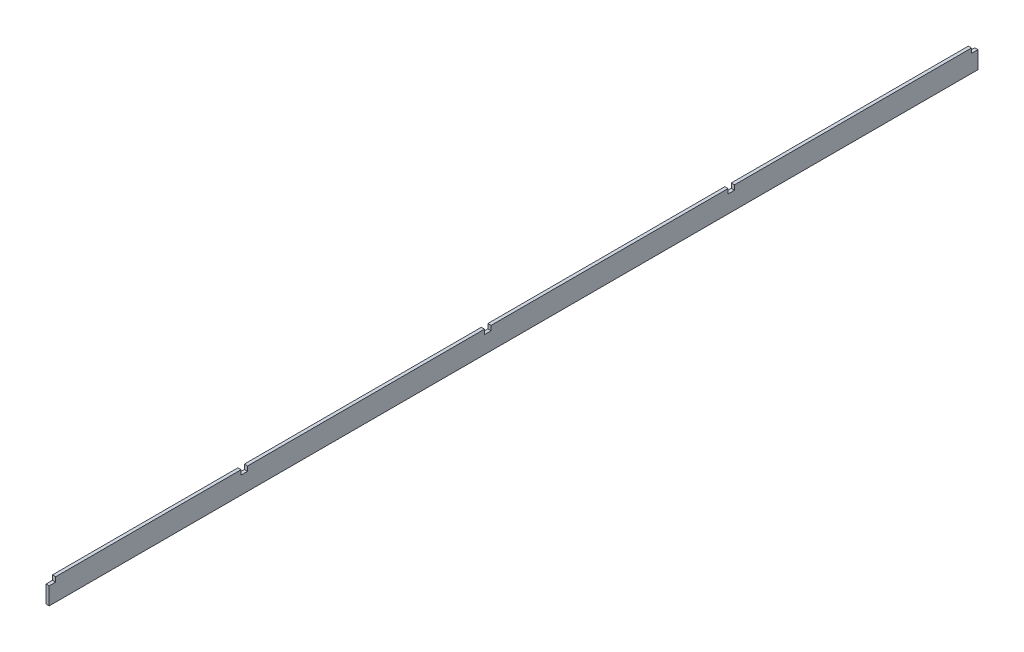
ISO-10303-21;
HEADER;
FILE_DESCRIPTION(('STEP AP214'),'2;1');
FILE_NAME('part.step','',(''),(''),'','','');
FILE_SCHEMA(('AUTOMOTIVE_DESIGN { 1 0 10303 214 1 1 1 1 }'));
ENDSEC;
DATA;
#1=APPLICATION_CONTEXT('core data for automotive mechanical design processes');
#2=APPLICATION_PROTOCOL_DEFINITION('international standard','automotive_design',2000,#1);
#3=PRODUCT_CONTEXT('',#1,'mechanical');
#4=PRODUCT('Part','Part','',(#3));
#5=PRODUCT_RELATED_PRODUCT_CATEGORY('part','',(#4));
#6=PRODUCT_DEFINITION_FORMATION('','',#4);
#7=PRODUCT_DEFINITION_CONTEXT('part definition',#1,'design');
#8=PRODUCT_DEFINITION('design','',#6,#7);
#9=PRODUCT_DEFINITION_SHAPE('','',#8);
#10=(LENGTH_UNIT() NAMED_UNIT(*) SI_UNIT(.MILLI.,.METRE.));
#11=(NAMED_UNIT(*) PLANE_ANGLE_UNIT() SI_UNIT($,.RADIAN.));
#12=(NAMED_UNIT(*) SI_UNIT($,.STERADIAN.) SOLID_ANGLE_UNIT());
#13=UNCERTAINTY_MEASURE_WITH_UNIT(LENGTH_MEASURE(1.E-05),#10,'distance_accuracy_value','');
#14=(GEOMETRIC_REPRESENTATION_CONTEXT(3) GLOBAL_UNCERTAINTY_ASSIGNED_CONTEXT((#13)) GLOBAL_UNIT_ASSIGNED_CONTEXT((#10,
#11,#12)) REPRESENTATION_CONTEXT('',''));
#15=CARTESIAN_POINT('',(0.,0.,0.));
#16=DIRECTION('',(0.,0.,1.));
#17=DIRECTION('',(1.,0.,0.));
#18=AXIS2_PLACEMENT_3D('',#15,#16,#17);
#19=CARTESIAN_POINT('',(795.106629248693,137.283876295924,-123.03125));
#20=DIRECTION('',(0.,0.,1.));
#21=DIRECTION('',(1.,0.,0.));
#22=AXIS2_PLACEMENT_3D('',#19,#20,#21);
#23=PLANE('',#22);
#24=DIRECTION('',(0.,1.,0.));
#25=VECTOR('',#24,1.);
#26=CARTESIAN_POINT('',(337.777897230405,137.283876295924,-123.03125));
#27=LINE('',#26,#25);
#28=CARTESIAN_POINT('',(337.777897230405,137.283876295924,-123.03125));
#29=VERTEX_POINT('',#28);
#30=CARTESIAN_POINT('',(337.777897230405,145.84143234043,-123.03125));
#31=VERTEX_POINT('',#30);
#32=EDGE_CURVE('E241',#29,#31,#27,.T.);
#33=ORIENTED_EDGE('',*,*,#32,.F.);
#34=DIRECTION('',(-1.,0.,0.));
#35=VECTOR('',#34,1.);
#36=CARTESIAN_POINT('',(795.106629248693,137.283876295924,-123.03125));
#37=LINE('',#36,#35);
#38=CARTESIAN_POINT('',(336.190397230405,137.283876295924,-123.03125));
#39=VERTEX_POINT('',#38);
#40=EDGE_CURVE('E37',#29,#39,#37,.T.);
#41=ORIENTED_EDGE('',*,*,#40,.T.);
#42=DIRECTION('',(0.,1.,0.));
#43=VECTOR('',#42,1.);
#44=CARTESIAN_POINT('',(336.190397230405,137.283876295924,-123.03125));
#45=LINE('',#44,#43);
#46=CARTESIAN_POINT('',(336.190397230405,145.84143234043,-123.03125));
#47=VERTEX_POINT('',#46);
#48=EDGE_CURVE('E249',#39,#47,#45,.T.);
#49=ORIENTED_EDGE('',*,*,#48,.T.);
#50=DIRECTION('',(-1.,0.,0.));
#51=VECTOR('',#50,1.);
#52=CARTESIAN_POINT('',(795.106629248693,145.84143234043,-123.03125));
#53=LINE('',#52,#51);
#54=EDGE_CURVE('E136',#31,#47,#53,.T.);
#55=ORIENTED_EDGE('',*,*,#54,.F.);
#56=EDGE_LOOP('',(#33,#41,#49,#55));
#57=FACE_BOUND('',#56,.T.);
#58=ADVANCED_FACE('F33',(#57),#23,.F.);
#59=CARTESIAN_POINT('',(795.106629248693,145.84143234043,-123.03125));
#60=DIRECTION('',(0.,-1.,0.));
#61=DIRECTION('',(0.,0.,-1.));
#62=AXIS2_PLACEMENT_3D('',#59,#60,#61);
#63=PLANE('',#62);
#64=DIRECTION('',(0.,0.,1.));
#65=VECTOR('',#64,1.);
#66=CARTESIAN_POINT('',(337.777897230405,145.84143234043,-123.03125));
#67=LINE('',#66,#65);
#68=CARTESIAN_POINT('',(337.777897230405,145.84143234043,-119.85625));
#69=VERTEX_POINT('',#68);
#70=EDGE_CURVE('E143',#31,#69,#67,.T.);
#71=ORIENTED_EDGE('',*,*,#70,.F.);
#72=ORIENTED_EDGE('',*,*,#54,.T.);
#73=DIRECTION('',(0.,0.,1.));
#74=VECTOR('',#73,1.);
#75=CARTESIAN_POINT('',(336.190397230405,145.84143234043,-123.03125));
#76=LINE('',#75,#74);
#77=CARTESIAN_POINT('',(336.190397230405,145.84143234043,-119.85625));
#78=VERTEX_POINT('',#77);
#79=EDGE_CURVE('E248',#47,#78,#76,.T.);
#80=ORIENTED_EDGE('',*,*,#79,.T.);
#81=DIRECTION('',(-1.,0.,0.));
#82=VECTOR('',#81,1.);
#83=CARTESIAN_POINT('',(795.106629248693,145.84143234043,-119.85625));
#84=LINE('',#83,#82);
#85=EDGE_CURVE('E250',#69,#78,#84,.T.);
#86=ORIENTED_EDGE('',*,*,#85,.F.);
#87=EDGE_LOOP('',(#71,#72,#80,#86));
#88=FACE_BOUND('',#87,.T.);
#89=ADVANCED_FACE('F338',(#88),#63,.F.);
#90=CARTESIAN_POINT('',(795.106629248693,145.84143234043,-119.85625));
#91=DIRECTION('',(0.,0.,1.));
#92=DIRECTION('',(1.,0.,0.));
#93=AXIS2_PLACEMENT_3D('',#90,#91,#92);
#94=PLANE('',#93);
#95=DIRECTION('',(0.,1.,0.));
#96=VECTOR('',#95,1.);
#97=CARTESIAN_POINT('',(337.777897230405,145.84143234043,-119.85625));
#98=LINE('',#97,#96);
#99=CARTESIAN_POINT('',(337.777897230405,148.134181796479,-119.85625));
#100=VERTEX_POINT('',#99);
#101=EDGE_CURVE('E237',#69,#100,#98,.T.);
#102=ORIENTED_EDGE('',*,*,#101,.F.);
#103=ORIENTED_EDGE('',*,*,#85,.T.);
#104=DIRECTION('',(0.,1.,0.));
#105=VECTOR('',#104,1.);
#106=CARTESIAN_POINT('',(336.190397230405,145.84143234043,-119.85625));
#107=LINE('',#106,#105);
#108=CARTESIAN_POINT('',(336.190397230405,148.134181796479,-119.85625));
#109=VERTEX_POINT('',#108);
#110=EDGE_CURVE('E252',#78,#109,#107,.T.);
#111=ORIENTED_EDGE('',*,*,#110,.T.);
#112=DIRECTION('',(-1.,0.,0.));
#113=VECTOR('',#112,1.);
#114=CARTESIAN_POINT('',(795.106629248693,148.134181796479,-119.85625));
#115=LINE('',#114,#113);
#116=EDGE_CURVE('E253',#100,#109,#115,.T.);
#117=ORIENTED_EDGE('',*,*,#116,.F.);
#118=EDGE_LOOP('',(#102,#103,#111,#117));
#119=FACE_BOUND('',#118,.T.);
#120=ADVANCED_FACE('F341',(#119),#94,.F.);
#121=CARTESIAN_POINT('',(795.106629248693,148.134181796479,-119.85625));
#122=DIRECTION('',(0.,-1.,0.));
#123=DIRECTION('',(0.,0.,-1.));
#124=AXIS2_PLACEMENT_3D('',#121,#122,#123);
#125=PLANE('',#124);
#126=DIRECTION('',(0.,0.,1.));
#127=VECTOR('',#126,1.);
#128=CARTESIAN_POINT('',(337.777897230405,148.134181796479,-119.85625));
#129=LINE('',#128,#127);
#130=CARTESIAN_POINT('',(337.777897230405,148.134181796479,-3.17499999999987));
#131=VERTEX_POINT('',#130);
#132=EDGE_CURVE('E234',#100,#131,#129,.T.);
#133=ORIENTED_EDGE('',*,*,#132,.F.);
#134=ORIENTED_EDGE('',*,*,#116,.T.);
#135=DIRECTION('',(0.,0.,1.));
#136=VECTOR('',#135,1.);
#137=CARTESIAN_POINT('',(336.190397230405,148.134181796479,-119.85625));
#138=LINE('',#137,#136);
#139=CARTESIAN_POINT('',(336.190397230405,148.134181796479,-3.17499999999987));
#140=VERTEX_POINT('',#139);
#141=EDGE_CURVE('E255',#109,#140,#138,.T.);
#142=ORIENTED_EDGE('',*,*,#141,.T.);
#143=DIRECTION('',(-1.,0.,0.));
#144=VECTOR('',#143,1.);
#145=CARTESIAN_POINT('',(795.106629248693,148.134181796479,-3.17499999999987));
#146=LINE('',#145,#144);
#147=EDGE_CURVE('E256',#131,#140,#146,.T.);
#148=ORIENTED_EDGE('',*,*,#147,.F.);
#149=EDGE_LOOP('',(#133,#134,#142,#148));
#150=FACE_BOUND('',#149,.T.);
#151=ADVANCED_FACE('F343',(#150),#125,.F.);
#152=CARTESIAN_POINT('',(795.106629248693,145.84143234043,-3.17499999999998));
#153=DIRECTION('',(0.,0.,-1.));
#154=DIRECTION('',(0.,1.,0.));
#155=AXIS2_PLACEMENT_3D('',#152,#153,#154);
#156=PLANE('',#155);
#157=DIRECTION('',(0.,-1.,0.));
#158=VECTOR('',#157,1.);
#159=CARTESIAN_POINT('',(337.777897230405,145.84143234043,-3.17499999999998));
#160=LINE('',#159,#158);
#161=CARTESIAN_POINT('',(337.777897230405,145.84143234043,-3.17499999999998));
#162=VERTEX_POINT('',#161);
#163=EDGE_CURVE('E231',#131,#162,#160,.T.);
#164=ORIENTED_EDGE('',*,*,#163,.F.);
#165=ORIENTED_EDGE('',*,*,#147,.T.);
#166=DIRECTION('',(0.,-1.,0.));
#167=VECTOR('',#166,1.);
#168=CARTESIAN_POINT('',(336.190397230405,145.84143234043,-3.17499999999998));
#169=LINE('',#168,#167);
#170=CARTESIAN_POINT('',(336.190397230405,145.84143234043,-3.17499999999998));
#171=VERTEX_POINT('',#170);
#172=EDGE_CURVE('E258',#140,#171,#169,.T.);
#173=ORIENTED_EDGE('',*,*,#172,.T.);
#174=DIRECTION('',(-1.,0.,0.));
#175=VECTOR('',#174,1.);
#176=CARTESIAN_POINT('',(795.106629248693,145.84143234043,-3.17499999999998));
#177=LINE('',#176,#175);
#178=EDGE_CURVE('E259',#162,#171,#177,.T.);
#179=ORIENTED_EDGE('',*,*,#178,.F.);
#180=EDGE_LOOP('',(#164,#165,#173,#179));
#181=FACE_BOUND('',#180,.T.);
#182=ADVANCED_FACE('F347',(#181),#156,.F.);
#183=CARTESIAN_POINT('',(795.106629248693,145.84143234043,0.));
#184=DIRECTION('',(0.,-1.,0.));
#185=DIRECTION('',(0.,0.,-1.));
#186=AXIS2_PLACEMENT_3D('',#183,#184,#185);
#187=PLANE('',#186);
#188=DIRECTION('',(0.,0.,1.));
#189=VECTOR('',#188,1.);
#190=CARTESIAN_POINT('',(337.777897230405,145.84143234043,0.));
#191=LINE('',#190,#189);
#192=CARTESIAN_POINT('',(337.777897230405,145.84143234043,0.));
#193=VERTEX_POINT('',#192);
#194=EDGE_CURVE('E228',#162,#193,#191,.T.);
#195=ORIENTED_EDGE('',*,*,#194,.F.);
#196=ORIENTED_EDGE('',*,*,#178,.T.);
#197=DIRECTION('',(0.,0.,1.));
#198=VECTOR('',#197,1.);
#199=CARTESIAN_POINT('',(336.190397230405,145.84143234043,0.));
#200=LINE('',#199,#198);
#201=CARTESIAN_POINT('',(336.190397230405,145.84143234043,0.));
#202=VERTEX_POINT('',#201);
#203=EDGE_CURVE('E261',#171,#202,#200,.T.);
#204=ORIENTED_EDGE('',*,*,#203,.T.);
#205=DIRECTION('',(-1.,0.,0.));
#206=VECTOR('',#205,1.);
#207=CARTESIAN_POINT('',(795.106629248693,145.84143234043,0.));
#208=LINE('',#207,#206);
#209=EDGE_CURVE('E262',#193,#202,#208,.T.);
#210=ORIENTED_EDGE('',*,*,#209,.F.);
#211=EDGE_LOOP('',(#195,#196,#204,#210));
#212=FACE_BOUND('',#211,.T.);
#213=ADVANCED_FACE('F352',(#212),#187,.F.);
#214=CARTESIAN_POINT('',(795.106629248693,145.84143234043,0.));
#215=DIRECTION('',(0.,0.,1.));
#216=DIRECTION('',(1.,0.,0.));
#217=AXIS2_PLACEMENT_3D('',#214,#215,#216);
#218=PLANE('',#217);
#219=DIRECTION('',(0.,1.,0.));
#220=VECTOR('',#219,1.);
#221=CARTESIAN_POINT('',(337.777897230405,145.84143234043,0.));
#222=LINE('',#221,#220);
#223=CARTESIAN_POINT('',(337.777897230405,148.134181796479,0.));
#224=VERTEX_POINT('',#223);
#225=EDGE_CURVE('E225',#193,#224,#222,.T.);
#226=ORIENTED_EDGE('',*,*,#225,.F.);
#227=ORIENTED_EDGE('',*,*,#209,.T.);
#228=DIRECTION('',(0.,1.,0.));
#229=VECTOR('',#228,1.);
#230=CARTESIAN_POINT('',(336.190397230405,145.84143234043,0.));
#231=LINE('',#230,#229);
#232=CARTESIAN_POINT('',(336.190397230405,148.134181796479,0.));
#233=VERTEX_POINT('',#232);
#234=EDGE_CURVE('E264',#202,#233,#231,.T.);
#235=ORIENTED_EDGE('',*,*,#234,.T.);
#236=DIRECTION('',(-1.,0.,0.));
#237=VECTOR('',#236,1.);
#238=CARTESIAN_POINT('',(795.106629248693,148.134181796479,0.));
#239=LINE('',#238,#237);
#240=EDGE_CURVE('E265',#224,#233,#239,.T.);
#241=ORIENTED_EDGE('',*,*,#240,.F.);
#242=EDGE_LOOP('',(#226,#227,#235,#241));
#243=FACE_BOUND('',#242,.T.);
#244=ADVANCED_FACE('F355',(#243),#218,.F.);
#245=CARTESIAN_POINT('',(795.106629248693,148.134181796479,0.));
#246=DIRECTION('',(0.,-1.,0.));
#247=DIRECTION('',(0.,0.,-1.));
#248=AXIS2_PLACEMENT_3D('',#245,#246,#247);
#249=PLANE('',#248);
#250=DIRECTION('',(0.,0.,1.));
#251=VECTOR('',#250,1.);
#252=CARTESIAN_POINT('',(337.777897230405,148.134181796479,0.));
#253=LINE('',#252,#251);
#254=CARTESIAN_POINT('',(337.777897230405,148.134181796479,116.68125));
#255=VERTEX_POINT('',#254);
#256=EDGE_CURVE('E222',#224,#255,#253,.T.);
#257=ORIENTED_EDGE('',*,*,#256,.F.);
#258=ORIENTED_EDGE('',*,*,#240,.T.);
#259=DIRECTION('',(0.,0.,1.));
#260=VECTOR('',#259,1.);
#261=CARTESIAN_POINT('',(336.190397230405,148.134181796479,0.));
#262=LINE('',#261,#260);
#263=CARTESIAN_POINT('',(336.190397230405,148.134181796479,116.68125));
#264=VERTEX_POINT('',#263);
#265=EDGE_CURVE('E267',#233,#264,#262,.T.);
#266=ORIENTED_EDGE('',*,*,#265,.T.);
#267=DIRECTION('',(-1.,0.,0.));
#268=VECTOR('',#267,1.);
#269=CARTESIAN_POINT('',(795.106629248693,148.134181796479,116.68125));
#270=LINE('',#269,#268);
#271=EDGE_CURVE('E268',#255,#264,#270,.T.);
#272=ORIENTED_EDGE('',*,*,#271,.F.);
#273=EDGE_LOOP('',(#257,#258,#266,#272));
#274=FACE_BOUND('',#273,.T.);
#275=ADVANCED_FACE('F359',(#274),#249,.F.);
#276=CARTESIAN_POINT('',(795.106629248693,145.84143234043,116.68125));
#277=DIRECTION('',(0.,0.,-1.));
#278=DIRECTION('',(0.,1.,0.));
#279=AXIS2_PLACEMENT_3D('',#276,#277,#278);
#280=PLANE('',#279);
#281=DIRECTION('',(0.,-1.,0.));
#282=VECTOR('',#281,1.);
#283=CARTESIAN_POINT('',(337.777897230405,145.84143234043,116.68125));
#284=LINE('',#283,#282);
#285=CARTESIAN_POINT('',(337.777897230405,145.84143234043,116.68125));
#286=VERTEX_POINT('',#285);
#287=EDGE_CURVE('E219',#255,#286,#284,.T.);
#288=ORIENTED_EDGE('',*,*,#287,.F.);
#289=ORIENTED_EDGE('',*,*,#271,.T.);
#290=DIRECTION('',(0.,-1.,0.));
#291=VECTOR('',#290,1.);
#292=CARTESIAN_POINT('',(336.190397230405,145.84143234043,116.68125));
#293=LINE('',#292,#291);
#294=CARTESIAN_POINT('',(336.190397230405,145.84143234043,116.68125));
#295=VERTEX_POINT('',#294);
#296=EDGE_CURVE('E270',#264,#295,#293,.T.);
#297=ORIENTED_EDGE('',*,*,#296,.T.);
#298=DIRECTION('',(-1.,0.,0.));
#299=VECTOR('',#298,1.);
#300=CARTESIAN_POINT('',(795.106629248693,145.84143234043,116.68125));
#301=LINE('',#300,#299);
#302=EDGE_CURVE('E271',#286,#295,#301,.T.);
#303=ORIENTED_EDGE('',*,*,#302,.F.);
#304=EDGE_LOOP('',(#288,#289,#297,#303));
#305=FACE_BOUND('',#304,.T.);
#306=ADVANCED_FACE('F364',(#305),#280,.F.);
#307=CARTESIAN_POINT('',(795.106629248693,145.84143234043,119.85625));
#308=DIRECTION('',(0.,-1.,0.));
#309=DIRECTION('',(0.,0.,-1.));
#310=AXIS2_PLACEMENT_3D('',#307,#308,#309);
#311=PLANE('',#310);
#312=DIRECTION('',(0.,0.,1.));
#313=VECTOR('',#312,1.);
#314=CARTESIAN_POINT('',(337.777897230405,145.84143234043,119.85625));
#315=LINE('',#314,#313);
#316=CARTESIAN_POINT('',(337.777897230405,145.84143234043,119.85625));
#317=VERTEX_POINT('',#316);
#318=EDGE_CURVE('E216',#286,#317,#315,.T.);
#319=ORIENTED_EDGE('',*,*,#318,.F.);
#320=ORIENTED_EDGE('',*,*,#302,.T.);
#321=DIRECTION('',(0.,0.,1.));
#322=VECTOR('',#321,1.);
#323=CARTESIAN_POINT('',(336.190397230405,145.84143234043,119.85625));
#324=LINE('',#323,#322);
#325=CARTESIAN_POINT('',(336.190397230405,145.84143234043,119.85625));
#326=VERTEX_POINT('',#325);
#327=EDGE_CURVE('E273',#295,#326,#324,.T.);
#328=ORIENTED_EDGE('',*,*,#327,.T.);
#329=DIRECTION('',(-1.,0.,0.));
#330=VECTOR('',#329,1.);
#331=CARTESIAN_POINT('',(795.106629248693,145.84143234043,119.85625));
#332=LINE('',#331,#330);
#333=EDGE_CURVE('E274',#317,#326,#332,.T.);
#334=ORIENTED_EDGE('',*,*,#333,.F.);
#335=EDGE_LOOP('',(#319,#320,#328,#334));
#336=FACE_BOUND('',#335,.T.);
#337=ADVANCED_FACE('F367',(#336),#311,.F.);
#338=CARTESIAN_POINT('',(795.106629248693,145.84143234043,119.85625));
#339=DIRECTION('',(0.,0.,1.));
#340=DIRECTION('',(1.,0.,0.));
#341=AXIS2_PLACEMENT_3D('',#338,#339,#340);
#342=PLANE('',#341);
#343=DIRECTION('',(0.,1.,0.));
#344=VECTOR('',#343,1.);
#345=CARTESIAN_POINT('',(337.777897230405,145.84143234043,119.85625));
#346=LINE('',#345,#344);
#347=CARTESIAN_POINT('',(337.777897230405,148.134181796479,119.85625));
#348=VERTEX_POINT('',#347);
#349=EDGE_CURVE('E213',#317,#348,#346,.T.);
#350=ORIENTED_EDGE('',*,*,#349,.F.);
#351=ORIENTED_EDGE('',*,*,#333,.T.);
#352=DIRECTION('',(0.,1.,0.));
#353=VECTOR('',#352,1.);
#354=CARTESIAN_POINT('',(336.190397230405,145.84143234043,119.85625));
#355=LINE('',#354,#353);
#356=CARTESIAN_POINT('',(336.190397230405,148.134181796479,119.85625));
#357=VERTEX_POINT('',#356);
#358=EDGE_CURVE('E276',#326,#357,#355,.T.);
#359=ORIENTED_EDGE('',*,*,#358,.T.);
#360=DIRECTION('',(-1.,0.,0.));
#361=VECTOR('',#360,1.);
#362=CARTESIAN_POINT('',(795.106629248693,148.134181796479,119.85625));
#363=LINE('',#362,#361);
#364=EDGE_CURVE('E277',#348,#357,#363,.T.);
#365=ORIENTED_EDGE('',*,*,#364,.F.);
#366=EDGE_LOOP('',(#350,#351,#359,#365));
#367=FACE_BOUND('',#366,.T.);
#368=ADVANCED_FACE('F371',(#367),#342,.F.);
#369=CARTESIAN_POINT('',(795.106629248693,148.134181796479,119.85625));
#370=DIRECTION('',(0.,-1.,0.));
#371=DIRECTION('',(0.,0.,-1.));
#372=AXIS2_PLACEMENT_3D('',#369,#370,#371);
#373=PLANE('',#372);
#374=DIRECTION('',(0.,0.,1.));
#375=VECTOR('',#374,1.);
#376=CARTESIAN_POINT('',(337.777897230405,148.134181796479,119.85625));
#377=LINE('',#376,#375);
#378=CARTESIAN_POINT('',(337.777897230405,148.134181796479,236.5375));
#379=VERTEX_POINT('',#378);
#380=EDGE_CURVE('E210',#348,#379,#377,.T.);
#381=ORIENTED_EDGE('',*,*,#380,.F.);
#382=ORIENTED_EDGE('',*,*,#364,.T.);
#383=DIRECTION('',(0.,0.,1.));
#384=VECTOR('',#383,1.);
#385=CARTESIAN_POINT('',(336.190397230405,148.134181796479,119.85625));
#386=LINE('',#385,#384);
#387=CARTESIAN_POINT('',(336.190397230405,148.134181796479,236.5375));
#388=VERTEX_POINT('',#387);
#389=EDGE_CURVE('E279',#357,#388,#386,.T.);
#390=ORIENTED_EDGE('',*,*,#389,.T.);
#391=DIRECTION('',(-1.,0.,0.));
#392=VECTOR('',#391,1.);
#393=CARTESIAN_POINT('',(795.106629248693,148.134181796479,236.5375));
#394=LINE('',#393,#392);
#395=EDGE_CURVE('E280',#379,#388,#394,.T.);
#396=ORIENTED_EDGE('',*,*,#395,.F.);
#397=EDGE_LOOP('',(#381,#382,#390,#396));
#398=FACE_BOUND('',#397,.T.);
#399=ADVANCED_FACE('F376',(#398),#373,.F.);
#400=CARTESIAN_POINT('',(795.106629248693,145.84143234043,236.5375));
#401=DIRECTION('',(0.,0.,-1.));
#402=DIRECTION('',(0.,1.,0.));
#403=AXIS2_PLACEMENT_3D('',#400,#401,#402);
#404=PLANE('',#403);
#405=DIRECTION('',(0.,-1.,0.));
#406=VECTOR('',#405,1.);
#407=CARTESIAN_POINT('',(337.777897230405,145.84143234043,236.5375));
#408=LINE('',#407,#406);
#409=CARTESIAN_POINT('',(337.777897230405,145.84143234043,236.5375));
#410=VERTEX_POINT('',#409);
#411=EDGE_CURVE('E207',#379,#410,#408,.T.);
#412=ORIENTED_EDGE('',*,*,#411,.F.);
#413=ORIENTED_EDGE('',*,*,#395,.T.);
#414=DIRECTION('',(0.,-1.,0.));
#415=VECTOR('',#414,1.);
#416=CARTESIAN_POINT('',(336.190397230405,145.84143234043,236.5375));
#417=LINE('',#416,#415);
#418=CARTESIAN_POINT('',(336.190397230405,145.84143234043,236.5375));
#419=VERTEX_POINT('',#418);
#420=EDGE_CURVE('E282',#388,#419,#417,.T.);
#421=ORIENTED_EDGE('',*,*,#420,.T.);
#422=DIRECTION('',(-1.,0.,0.));
#423=VECTOR('',#422,1.);
#424=CARTESIAN_POINT('',(795.106629248693,145.84143234043,236.5375));
#425=LINE('',#424,#423);
#426=EDGE_CURVE('E283',#410,#419,#425,.T.);
#427=ORIENTED_EDGE('',*,*,#426,.F.);
#428=EDGE_LOOP('',(#412,#413,#421,#427));
#429=FACE_BOUND('',#428,.T.);
#430=ADVANCED_FACE('F379',(#429),#404,.F.);
#431=CARTESIAN_POINT('',(795.106629248693,145.84143234043,239.7125));
#432=DIRECTION('',(0.,-1.,0.));
#433=DIRECTION('',(0.,0.,-1.));
#434=AXIS2_PLACEMENT_3D('',#431,#432,#433);
#435=PLANE('',#434);
#436=DIRECTION('',(0.,0.,1.));
#437=VECTOR('',#436,1.);
#438=CARTESIAN_POINT('',(337.777897230405,145.84143234043,239.7125));
#439=LINE('',#438,#437);
#440=CARTESIAN_POINT('',(337.777897230405,145.84143234043,239.7125));
#441=VERTEX_POINT('',#440);
#442=EDGE_CURVE('E204',#410,#441,#439,.T.);
#443=ORIENTED_EDGE('',*,*,#442,.F.);
#444=ORIENTED_EDGE('',*,*,#426,.T.);
#445=DIRECTION('',(0.,0.,1.));
#446=VECTOR('',#445,1.);
#447=CARTESIAN_POINT('',(336.190397230405,145.84143234043,239.7125));
#448=LINE('',#447,#446);
#449=CARTESIAN_POINT('',(336.190397230405,145.84143234043,239.7125));
#450=VERTEX_POINT('',#449);
#451=EDGE_CURVE('E285',#419,#450,#448,.T.);
#452=ORIENTED_EDGE('',*,*,#451,.T.);
#453=DIRECTION('',(-1.,0.,0.));
#454=VECTOR('',#453,1.);
#455=CARTESIAN_POINT('',(795.106629248693,145.84143234043,239.7125));
#456=LINE('',#455,#454);
#457=EDGE_CURVE('E286',#441,#450,#456,.T.);
#458=ORIENTED_EDGE('',*,*,#457,.F.);
#459=EDGE_LOOP('',(#443,#444,#452,#458));
#460=FACE_BOUND('',#459,.T.);
#461=ADVANCED_FACE('F383',(#460),#435,.F.);
#462=CARTESIAN_POINT('',(795.106629248693,145.84143234043,239.7125));
#463=DIRECTION('',(0.,0.,1.));
#464=DIRECTION('',(1.,0.,0.));
#465=AXIS2_PLACEMENT_3D('',#462,#463,#464);
#466=PLANE('',#465);
#467=DIRECTION('',(0.,1.,0.));
#468=VECTOR('',#467,1.);
#469=CARTESIAN_POINT('',(337.777897230405,145.84143234043,239.7125));
#470=LINE('',#469,#468);
#471=CARTESIAN_POINT('',(337.777897230405,148.134181796479,239.7125));
#472=VERTEX_POINT('',#471);
#473=EDGE_CURVE('E201',#441,#472,#470,.T.);
#474=ORIENTED_EDGE('',*,*,#473,.F.);
#475=ORIENTED_EDGE('',*,*,#457,.T.);
#476=DIRECTION('',(0.,1.,0.));
#477=VECTOR('',#476,1.);
#478=CARTESIAN_POINT('',(336.190397230405,145.84143234043,239.7125));
#479=LINE('',#478,#477);
#480=CARTESIAN_POINT('',(336.190397230405,148.134181796479,239.7125));
#481=VERTEX_POINT('',#480);
#482=EDGE_CURVE('E288',#450,#481,#479,.T.);
#483=ORIENTED_EDGE('',*,*,#482,.T.);
#484=DIRECTION('',(-1.,0.,0.));
#485=VECTOR('',#484,1.);
#486=CARTESIAN_POINT('',(795.106629248693,148.134181796479,239.7125));
#487=LINE('',#486,#485);
#488=EDGE_CURVE('E289',#472,#481,#487,.T.);
#489=ORIENTED_EDGE('',*,*,#488,.F.);
#490=EDGE_LOOP('',(#474,#475,#483,#489));
#491=FACE_BOUND('',#490,.T.);
#492=ADVANCED_FACE('F388',(#491),#466,.F.);
#493=CARTESIAN_POINT('',(795.106629248693,148.134181796479,239.7125));
#494=DIRECTION('',(0.,-1.,0.));
#495=DIRECTION('',(0.,0.,-1.));
#496=AXIS2_PLACEMENT_3D('',#493,#494,#495);
#497=PLANE('',#496);
#498=DIRECTION('',(0.,0.,1.));
#499=VECTOR('',#498,1.);
#500=CARTESIAN_POINT('',(337.777897230405,148.134181796479,239.7125));
#501=LINE('',#500,#499);
#502=CARTESIAN_POINT('',(337.777897230405,148.134181796479,330.99375));
#503=VERTEX_POINT('',#502);
#504=EDGE_CURVE('E196',#472,#503,#501,.T.);
#505=ORIENTED_EDGE('',*,*,#504,.F.);
#506=ORIENTED_EDGE('',*,*,#488,.T.);
#507=DIRECTION('',(0.,0.,1.));
#508=VECTOR('',#507,1.);
#509=CARTESIAN_POINT('',(336.190397230405,148.134181796479,239.7125));
#510=LINE('',#509,#508);
#511=CARTESIAN_POINT('',(336.190397230405,148.134181796479,330.99375));
#512=VERTEX_POINT('',#511);
#513=EDGE_CURVE('E291',#481,#512,#510,.T.);
#514=ORIENTED_EDGE('',*,*,#513,.T.);
#515=DIRECTION('',(-1.,0.,0.));
#516=VECTOR('',#515,1.);
#517=CARTESIAN_POINT('',(795.106629248693,148.134181796479,330.99375));
#518=LINE('',#517,#516);
#519=EDGE_CURVE('E292',#503,#512,#518,.T.);
#520=ORIENTED_EDGE('',*,*,#519,.F.);
#521=EDGE_LOOP('',(#505,#506,#514,#520));
#522=FACE_BOUND('',#521,.T.);
#523=ADVANCED_FACE('F391',(#522),#497,.F.);
#524=CARTESIAN_POINT('',(795.106629248693,148.134181796479,330.99375));
#525=DIRECTION('',(0.,0.,-1.));
#526=DIRECTION('',(-1.,0.,0.));
#527=AXIS2_PLACEMENT_3D('',#524,#525,#526);
#528=PLANE('',#527);
#529=DIRECTION('',(0.,-1.,0.));
#530=VECTOR('',#529,1.);
#531=CARTESIAN_POINT('',(337.777897230405,148.134181796479,330.99375));
#532=LINE('',#531,#530);
#533=CARTESIAN_POINT('',(337.777897230405,145.84143234043,330.99375));
#534=VERTEX_POINT('',#533);
#535=EDGE_CURVE('E194',#503,#534,#532,.T.);
#536=ORIENTED_EDGE('',*,*,#535,.F.);
#537=ORIENTED_EDGE('',*,*,#519,.T.);
#538=DIRECTION('',(0.,-1.,0.));
#539=VECTOR('',#538,1.);
#540=CARTESIAN_POINT('',(336.190397230405,148.134181796479,330.99375));
#541=LINE('',#540,#539);
#542=CARTESIAN_POINT('',(336.190397230405,145.84143234043,330.99375));
#543=VERTEX_POINT('',#542);
#544=EDGE_CURVE('E294',#512,#543,#541,.T.);
#545=ORIENTED_EDGE('',*,*,#544,.T.);
#546=DIRECTION('',(-1.,0.,0.));
#547=VECTOR('',#546,1.);
#548=CARTESIAN_POINT('',(795.106629248693,145.84143234043,330.99375));
#549=LINE('',#548,#547);
#550=EDGE_CURVE('E295',#534,#543,#549,.T.);
#551=ORIENTED_EDGE('',*,*,#550,.F.);
#552=EDGE_LOOP('',(#536,#537,#545,#551));
#553=FACE_BOUND('',#552,.T.);
#554=ADVANCED_FACE('F395',(#553),#528,.F.);
#555=CARTESIAN_POINT('',(795.106629248693,145.84143234043,334.16875));
#556=DIRECTION('',(0.,-1.,0.));
#557=DIRECTION('',(0.,0.,-1.));
#558=AXIS2_PLACEMENT_3D('',#555,#556,#557);
#559=PLANE('',#558);
#560=DIRECTION('',(0.,0.,1.));
#561=VECTOR('',#560,1.);
#562=CARTESIAN_POINT('',(337.777897230405,145.84143234043,334.16875));
#563=LINE('',#562,#561);
#564=CARTESIAN_POINT('',(337.777897230405,145.84143234043,334.16875));
#565=VERTEX_POINT('',#564);
#566=EDGE_CURVE('E42',#534,#565,#563,.T.);
#567=ORIENTED_EDGE('',*,*,#566,.F.);
#568=ORIENTED_EDGE('',*,*,#550,.T.);
#569=DIRECTION('',(0.,0.,1.));
#570=VECTOR('',#569,1.);
#571=CARTESIAN_POINT('',(336.190397230405,145.84143234043,334.16875));
#572=LINE('',#571,#570);
#573=CARTESIAN_POINT('',(336.190397230405,145.84143234043,334.16875));
#574=VERTEX_POINT('',#573);
#575=EDGE_CURVE('E188',#543,#574,#572,.T.);
#576=ORIENTED_EDGE('',*,*,#575,.T.);
#577=DIRECTION('',(-1.,0.,0.));
#578=VECTOR('',#577,1.);
#579=CARTESIAN_POINT('',(795.106629248693,145.84143234043,334.16875));
#580=LINE('',#579,#578);
#581=EDGE_CURVE('E179',#565,#574,#580,.T.);
#582=ORIENTED_EDGE('',*,*,#581,.F.);
#583=EDGE_LOOP('',(#567,#568,#576,#582));
#584=FACE_BOUND('',#583,.T.);
#585=ADVANCED_FACE('F185',(#584),#559,.F.);
#586=CARTESIAN_POINT('',(795.106629248693,137.283876295924,334.16875));
#587=DIRECTION('',(0.,0.,-1.));
#588=DIRECTION('',(-1.,0.,0.));
#589=AXIS2_PLACEMENT_3D('',#586,#587,#588);
#590=PLANE('',#589);
#591=DIRECTION('',(0.,-1.,0.));
#592=VECTOR('',#591,1.);
#593=CARTESIAN_POINT('',(337.777897230405,137.283876295924,334.16875));
#594=LINE('',#593,#592);
#595=CARTESIAN_POINT('',(337.777897230405,137.283876295924,334.16875));
#596=VERTEX_POINT('',#595);
#597=EDGE_CURVE('E11',#565,#596,#594,.T.);
#598=ORIENTED_EDGE('',*,*,#597,.F.);
#599=ORIENTED_EDGE('',*,*,#581,.T.);
#600=DIRECTION('',(0.,-1.,0.));
#601=VECTOR('',#600,1.);
#602=CARTESIAN_POINT('',(336.190397230405,137.283876295924,334.16875));
#603=LINE('',#602,#601);
#604=CARTESIAN_POINT('',(336.190397230405,137.283876295924,334.16875));
#605=VERTEX_POINT('',#604);
#606=EDGE_CURVE('E190',#574,#605,#603,.T.);
#607=ORIENTED_EDGE('',*,*,#606,.T.);
#608=DIRECTION('',(-1.,0.,0.));
#609=VECTOR('',#608,1.);
#610=CARTESIAN_POINT('',(795.106629248693,137.283876295924,334.16875));
#611=LINE('',#610,#609);
#612=EDGE_CURVE('E55',#596,#605,#611,.T.);
#613=ORIENTED_EDGE('',*,*,#612,.F.);
#614=EDGE_LOOP('',(#598,#599,#607,#613));
#615=FACE_BOUND('',#614,.T.);
#616=ADVANCED_FACE('F177',(#615),#590,.F.);
#617=CARTESIAN_POINT('',(795.106629248693,137.283876295924,-119.85625));
#618=DIRECTION('',(0.,1.,0.));
#619=DIRECTION('',(0.,0.,1.));
#620=AXIS2_PLACEMENT_3D('',#617,#618,#619);
#621=PLANE('',#620);
#622=DIRECTION('',(0.,0.,-1.));
#623=VECTOR('',#622,1.);
#624=CARTESIAN_POINT('',(337.777897230405,137.283876295924,-119.85625));
#625=LINE('',#624,#623);
#626=EDGE_CURVE('E244',#596,#29,#625,.T.);
#627=ORIENTED_EDGE('',*,*,#626,.F.);
#628=ORIENTED_EDGE('',*,*,#612,.T.);
#629=DIRECTION('',(0.,0.,-1.));
#630=VECTOR('',#629,1.);
#631=CARTESIAN_POINT('',(336.190397230405,137.283876295924,-119.85625));
#632=LINE('',#631,#630);
#633=EDGE_CURVE('E246',#605,#39,#632,.T.);
#634=ORIENTED_EDGE('',*,*,#633,.T.);
#635=ORIENTED_EDGE('',*,*,#40,.F.);
#636=EDGE_LOOP('',(#627,#628,#634,#635));
#637=FACE_BOUND('',#636,.T.);
#638=ADVANCED_FACE('F333',(#637),#621,.F.);
#639=CARTESIAN_POINT('',(336.190397230405,0.,0.));
#640=DIRECTION('',(1.,0.,0.));
#641=DIRECTION('',(0.,0.,-1.));
#642=AXIS2_PLACEMENT_3D('',#639,#640,#641);
#643=PLANE('',#642);
#644=ORIENTED_EDGE('',*,*,#48,.F.);
#645=ORIENTED_EDGE('',*,*,#633,.F.);
#646=ORIENTED_EDGE('',*,*,#606,.F.);
#647=ORIENTED_EDGE('',*,*,#575,.F.);
#648=ORIENTED_EDGE('',*,*,#544,.F.);
#649=ORIENTED_EDGE('',*,*,#513,.F.);
#650=ORIENTED_EDGE('',*,*,#482,.F.);
#651=ORIENTED_EDGE('',*,*,#451,.F.);
#652=ORIENTED_EDGE('',*,*,#420,.F.);
#653=ORIENTED_EDGE('',*,*,#389,.F.);
#654=ORIENTED_EDGE('',*,*,#358,.F.);
#655=ORIENTED_EDGE('',*,*,#327,.F.);
#656=ORIENTED_EDGE('',*,*,#296,.F.);
#657=ORIENTED_EDGE('',*,*,#265,.F.);
#658=ORIENTED_EDGE('',*,*,#234,.F.);
#659=ORIENTED_EDGE('',*,*,#203,.F.);
#660=ORIENTED_EDGE('',*,*,#172,.F.);
#661=ORIENTED_EDGE('',*,*,#141,.F.);
#662=ORIENTED_EDGE('',*,*,#110,.F.);
#663=ORIENTED_EDGE('',*,*,#79,.F.);
#664=EDGE_LOOP('',(#644,#645,#646,#647,#648,#649,#650,#651,#652,#653,#654,#655,#656,#657,#658,
#659,#660,#661,#662,#663));
#665=FACE_BOUND('',#664,.T.);
#666=ADVANCED_FACE('F335',(#665),#643,.F.);
#667=CARTESIAN_POINT('',(337.777897230405,128.21355438592,334.16875));
#668=DIRECTION('',(1.,0.,0.));
#669=DIRECTION('',(0.,0.,-1.));
#670=AXIS2_PLACEMENT_3D('',#667,#668,#669);
#671=PLANE('',#670);
#672=ORIENTED_EDGE('',*,*,#626,.T.);
#673=ORIENTED_EDGE('',*,*,#32,.T.);
#674=ORIENTED_EDGE('',*,*,#70,.T.);
#675=ORIENTED_EDGE('',*,*,#101,.T.);
#676=ORIENTED_EDGE('',*,*,#132,.T.);
#677=ORIENTED_EDGE('',*,*,#163,.T.);
#678=ORIENTED_EDGE('',*,*,#194,.T.);
#679=ORIENTED_EDGE('',*,*,#225,.T.);
#680=ORIENTED_EDGE('',*,*,#256,.T.);
#681=ORIENTED_EDGE('',*,*,#287,.T.);
#682=ORIENTED_EDGE('',*,*,#318,.T.);
#683=ORIENTED_EDGE('',*,*,#349,.T.);
#684=ORIENTED_EDGE('',*,*,#380,.T.);
#685=ORIENTED_EDGE('',*,*,#411,.T.);
#686=ORIENTED_EDGE('',*,*,#442,.T.);
#687=ORIENTED_EDGE('',*,*,#473,.T.);
#688=ORIENTED_EDGE('',*,*,#504,.T.);
#689=ORIENTED_EDGE('',*,*,#535,.T.);
#690=ORIENTED_EDGE('',*,*,#566,.T.);
#691=ORIENTED_EDGE('',*,*,#597,.T.);
#692=EDGE_LOOP('',(#672,#673,#674,#675,#676,#677,#678,#679,#680,#681,#682,#683,#684,#685,#686,
#687,#688,#689,#690,#691));
#693=FACE_BOUND('',#692,.T.);
#694=ADVANCED_FACE('F35',(#693),#671,.T.);
#695=CLOSED_SHELL('',(#58,#89,#120,#151,#182,#213,#244,#275,#306,#337,#368,#399,#430,#461,#492,
#523,#554,#585,#616,#638,#666,#694));
#696=MANIFOLD_SOLID_BREP('B2',#695);
#697=ADVANCED_BREP_SHAPE_REPRESENTATION('',(#18,#696),#14);
#698=SHAPE_DEFINITION_REPRESENTATION(#9,#697);
ENDSEC;
END-ISO-10303-21;
